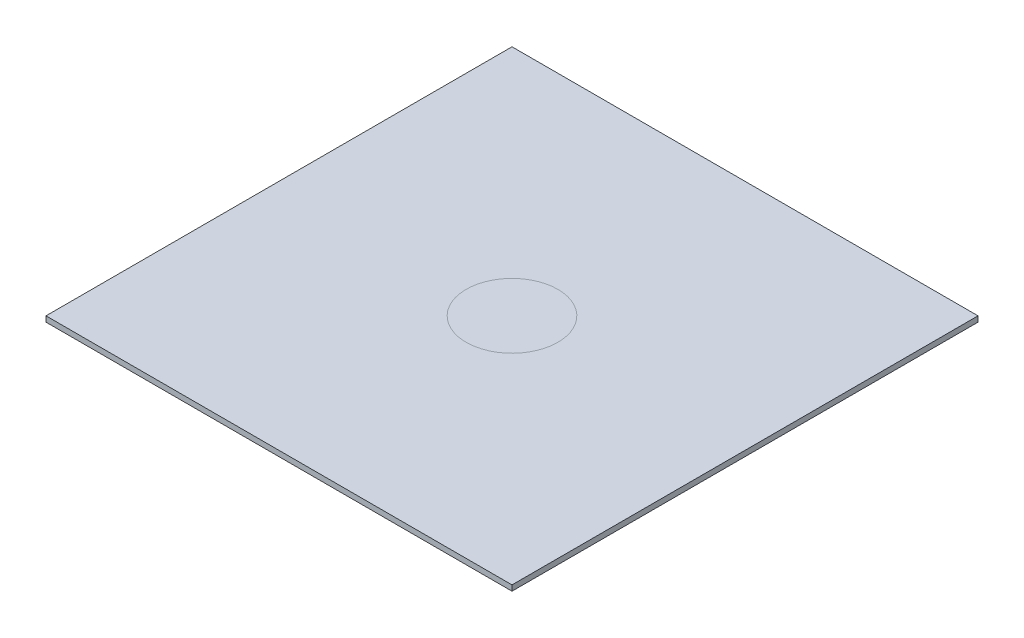
ISO-10303-21;
HEADER;
FILE_DESCRIPTION(('STEP AP214'),'2;1');
FILE_NAME('part.step','',(''),(''),'','','');
FILE_SCHEMA(('AUTOMOTIVE_DESIGN { 1 0 10303 214 1 1 1 1 }'));
ENDSEC;
DATA;
#1=APPLICATION_CONTEXT('core data for automotive mechanical design processes');
#2=APPLICATION_PROTOCOL_DEFINITION('international standard','automotive_design',2000,#1);
#3=PRODUCT_CONTEXT('',#1,'mechanical');
#4=PRODUCT('Part','Part','',(#3));
#5=PRODUCT_RELATED_PRODUCT_CATEGORY('part','',(#4));
#6=PRODUCT_DEFINITION_FORMATION('','',#4);
#7=PRODUCT_DEFINITION_CONTEXT('part definition',#1,'design');
#8=PRODUCT_DEFINITION('design','',#6,#7);
#9=PRODUCT_DEFINITION_SHAPE('','',#8);
#10=(LENGTH_UNIT() NAMED_UNIT(*) SI_UNIT(.MILLI.,.METRE.));
#11=(NAMED_UNIT(*) PLANE_ANGLE_UNIT() SI_UNIT($,.RADIAN.));
#12=(NAMED_UNIT(*) SI_UNIT($,.STERADIAN.) SOLID_ANGLE_UNIT());
#13=UNCERTAINTY_MEASURE_WITH_UNIT(LENGTH_MEASURE(1.E-05),#10,'distance_accuracy_value','');
#14=(GEOMETRIC_REPRESENTATION_CONTEXT(3) GLOBAL_UNCERTAINTY_ASSIGNED_CONTEXT((#13)) GLOBAL_UNIT_ASSIGNED_CONTEXT((#10,
#11,#12)) REPRESENTATION_CONTEXT('',''));
#15=CARTESIAN_POINT('',(0.,0.,0.));
#16=DIRECTION('',(0.,0.,1.));
#17=DIRECTION('',(1.,0.,0.));
#18=AXIS2_PLACEMENT_3D('',#15,#16,#17);
#19=CARTESIAN_POINT('',(0.,1.5,0.));
#20=DIRECTION('',(0.,-1.,0.));
#21=DIRECTION('',(0.,0.,-1.));
#22=AXIS2_PLACEMENT_3D('',#19,#20,#21);
#23=PLANE('',#22);
#24=DIRECTION('',(0.,0.,-1.));
#25=VECTOR('',#24,1.);
#26=CARTESIAN_POINT('',(127.,1.5,127.));
#27=LINE('',#26,#25);
#28=CARTESIAN_POINT('',(127.,1.5,127.));
#29=VERTEX_POINT('',#28);
#30=CARTESIAN_POINT('',(127.,1.5,-127.));
#31=VERTEX_POINT('',#30);
#32=EDGE_CURVE('E101',#29,#31,#27,.T.);
#33=ORIENTED_EDGE('',*,*,#32,.T.);
#34=DIRECTION('',(-1.,0.,0.));
#35=VECTOR('',#34,1.);
#36=CARTESIAN_POINT('',(-127.,1.5,-127.));
#37=LINE('',#36,#35);
#38=CARTESIAN_POINT('',(-127.,1.5,-127.));
#39=VERTEX_POINT('',#38);
#40=EDGE_CURVE('E90',#31,#39,#37,.T.);
#41=ORIENTED_EDGE('',*,*,#40,.T.);
#42=DIRECTION('',(0.,0.,1.));
#43=VECTOR('',#42,1.);
#44=CARTESIAN_POINT('',(-127.,1.5,127.));
#45=LINE('',#44,#43);
#46=CARTESIAN_POINT('',(-127.,1.5,127.));
#47=VERTEX_POINT('',#46);
#48=EDGE_CURVE('E100',#39,#47,#45,.T.);
#49=ORIENTED_EDGE('',*,*,#48,.T.);
#50=DIRECTION('',(1.,0.,0.));
#51=VECTOR('',#50,1.);
#52=CARTESIAN_POINT('',(-127.,1.5,127.));
#53=LINE('',#52,#51);
#54=EDGE_CURVE('E106',#47,#29,#53,.T.);
#55=ORIENTED_EDGE('',*,*,#54,.T.);
#56=EDGE_LOOP('',(#33,#41,#49,#55));
#57=FACE_BOUND('',#56,.T.);
#58=CARTESIAN_POINT('',(0.,1.5,0.));
#59=DIRECTION('',(0.,-1.,0.));
#60=DIRECTION('',(0.,0.,-1.));
#61=AXIS2_PLACEMENT_3D('',#58,#59,#60);
#62=CIRCLE('',#61,25.);
#63=CARTESIAN_POINT('',(0.,1.5,-25.));
#64=VERTEX_POINT('',#63);
#65=EDGE_CURVE('E11',#64,#64,#62,.F.);
#66=ORIENTED_EDGE('',*,*,#65,.F.);
#67=EDGE_LOOP('',(#66));
#68=FACE_BOUND('',#67,.T.);
#69=ADVANCED_FACE('F39',(#57,#68),#23,.F.);
#70=CARTESIAN_POINT('',(0.,-1.5,0.));
#71=DIRECTION('',(0.,-1.,0.));
#72=DIRECTION('',(0.,0.,-1.));
#73=AXIS2_PLACEMENT_3D('',#70,#71,#72);
#74=PLANE('',#73);
#75=DIRECTION('',(0.,0.,-1.));
#76=VECTOR('',#75,1.);
#77=CARTESIAN_POINT('',(127.,-1.5,127.));
#78=LINE('',#77,#76);
#79=CARTESIAN_POINT('',(127.,-1.5,127.));
#80=VERTEX_POINT('',#79);
#81=CARTESIAN_POINT('',(127.,-1.5,-127.));
#82=VERTEX_POINT('',#81);
#83=EDGE_CURVE('E113',#80,#82,#78,.T.);
#84=ORIENTED_EDGE('',*,*,#83,.F.);
#85=DIRECTION('',(1.,0.,0.));
#86=VECTOR('',#85,1.);
#87=CARTESIAN_POINT('',(-127.,-1.5,127.));
#88=LINE('',#87,#86);
#89=CARTESIAN_POINT('',(-127.,-1.5,127.));
#90=VERTEX_POINT('',#89);
#91=EDGE_CURVE('E110',#90,#80,#88,.T.);
#92=ORIENTED_EDGE('',*,*,#91,.F.);
#93=DIRECTION('',(0.,0.,1.));
#94=VECTOR('',#93,1.);
#95=CARTESIAN_POINT('',(-127.,-1.5,127.));
#96=LINE('',#95,#94);
#97=CARTESIAN_POINT('',(-127.,-1.5,-127.));
#98=VERTEX_POINT('',#97);
#99=EDGE_CURVE('E207',#98,#90,#96,.T.);
#100=ORIENTED_EDGE('',*,*,#99,.F.);
#101=DIRECTION('',(-1.,0.,0.));
#102=VECTOR('',#101,1.);
#103=CARTESIAN_POINT('',(-127.,-1.5,-127.));
#104=LINE('',#103,#102);
#105=EDGE_CURVE('E210',#82,#98,#104,.T.);
#106=ORIENTED_EDGE('',*,*,#105,.F.);
#107=EDGE_LOOP('',(#84,#92,#100,#106));
#108=FACE_BOUND('',#107,.T.);
#109=DIRECTION('',(1.,0.,0.));
#110=VECTOR('',#109,1.);
#111=CARTESIAN_POINT('',(0.,-1.5,107.));
#112=LINE('',#111,#110);
#113=CARTESIAN_POINT('',(-107.,-1.5,107.));
#114=VERTEX_POINT('',#113);
#115=CARTESIAN_POINT('',(107.,-1.5,107.));
#116=VERTEX_POINT('',#115);
#117=EDGE_CURVE('E58',#114,#116,#112,.T.);
#118=ORIENTED_EDGE('',*,*,#117,.T.);
#119=DIRECTION('',(0.,0.,-1.));
#120=VECTOR('',#119,1.);
#121=CARTESIAN_POINT('',(107.,-1.5,0.));
#122=LINE('',#121,#120);
#123=CARTESIAN_POINT('',(107.,-1.5,-107.));
#124=VERTEX_POINT('',#123);
#125=EDGE_CURVE('E48',#116,#124,#122,.T.);
#126=ORIENTED_EDGE('',*,*,#125,.T.);
#127=DIRECTION('',(-1.,0.,0.));
#128=VECTOR('',#127,1.);
#129=CARTESIAN_POINT('',(0.,-1.5,-107.));
#130=LINE('',#129,#128);
#131=CARTESIAN_POINT('',(-107.,-1.5,-107.));
#132=VERTEX_POINT('',#131);
#133=EDGE_CURVE('E114',#124,#132,#130,.T.);
#134=ORIENTED_EDGE('',*,*,#133,.T.);
#135=DIRECTION('',(0.,0.,1.));
#136=VECTOR('',#135,1.);
#137=CARTESIAN_POINT('',(-107.,-1.5,0.));
#138=LINE('',#137,#136);
#139=EDGE_CURVE('E118',#132,#114,#138,.T.);
#140=ORIENTED_EDGE('',*,*,#139,.T.);
#141=EDGE_LOOP('',(#118,#126,#134,#140));
#142=FACE_BOUND('',#141,.T.);
#143=ADVANCED_FACE('F131',(#108,#142),#74,.T.);
#144=CARTESIAN_POINT('',(127.,1.5,127.));
#145=DIRECTION('',(-1.,0.,0.));
#146=DIRECTION('',(0.,0.,1.));
#147=AXIS2_PLACEMENT_3D('',#144,#145,#146);
#148=PLANE('',#147);
#149=ORIENTED_EDGE('',*,*,#83,.T.);
#150=DIRECTION('',(0.,-1.,0.));
#151=VECTOR('',#150,1.);
#152=CARTESIAN_POINT('',(127.,1.5,-127.));
#153=LINE('',#152,#151);
#154=EDGE_CURVE('E94',#31,#82,#153,.T.);
#155=ORIENTED_EDGE('',*,*,#154,.F.);
#156=ORIENTED_EDGE('',*,*,#32,.F.);
#157=DIRECTION('',(0.,-1.,0.));
#158=VECTOR('',#157,1.);
#159=CARTESIAN_POINT('',(127.,1.5,127.));
#160=LINE('',#159,#158);
#161=EDGE_CURVE('E212',#29,#80,#160,.T.);
#162=ORIENTED_EDGE('',*,*,#161,.T.);
#163=EDGE_LOOP('',(#149,#155,#156,#162));
#164=FACE_BOUND('',#163,.T.);
#165=ADVANCED_FACE('F41',(#164),#148,.F.);
#166=CARTESIAN_POINT('',(-127.,1.5,-127.));
#167=DIRECTION('',(0.,0.,1.));
#168=DIRECTION('',(1.,0.,0.));
#169=AXIS2_PLACEMENT_3D('',#166,#167,#168);
#170=PLANE('',#169);
#171=ORIENTED_EDGE('',*,*,#105,.T.);
#172=DIRECTION('',(0.,-1.,0.));
#173=VECTOR('',#172,1.);
#174=CARTESIAN_POINT('',(-127.,1.5,-127.));
#175=LINE('',#174,#173);
#176=EDGE_CURVE('E97',#39,#98,#175,.T.);
#177=ORIENTED_EDGE('',*,*,#176,.F.);
#178=ORIENTED_EDGE('',*,*,#40,.F.);
#179=ORIENTED_EDGE('',*,*,#154,.T.);
#180=EDGE_LOOP('',(#171,#177,#178,#179));
#181=FACE_BOUND('',#180,.T.);
#182=ADVANCED_FACE('F92',(#181),#170,.F.);
#183=CARTESIAN_POINT('',(-127.,1.5,127.));
#184=DIRECTION('',(1.,0.,0.));
#185=DIRECTION('',(0.,0.,-1.));
#186=AXIS2_PLACEMENT_3D('',#183,#184,#185);
#187=PLANE('',#186);
#188=ORIENTED_EDGE('',*,*,#99,.T.);
#189=DIRECTION('',(0.,-1.,0.));
#190=VECTOR('',#189,1.);
#191=CARTESIAN_POINT('',(-127.,1.5,127.));
#192=LINE('',#191,#190);
#193=EDGE_CURVE('E120',#47,#90,#192,.T.);
#194=ORIENTED_EDGE('',*,*,#193,.F.);
#195=ORIENTED_EDGE('',*,*,#48,.F.);
#196=ORIENTED_EDGE('',*,*,#176,.T.);
#197=EDGE_LOOP('',(#188,#194,#195,#196));
#198=FACE_BOUND('',#197,.T.);
#199=ADVANCED_FACE('F167',(#198),#187,.F.);
#200=CARTESIAN_POINT('',(-127.,1.5,127.));
#201=DIRECTION('',(0.,0.,-1.));
#202=DIRECTION('',(-1.,0.,0.));
#203=AXIS2_PLACEMENT_3D('',#200,#201,#202);
#204=PLANE('',#203);
#205=ORIENTED_EDGE('',*,*,#91,.T.);
#206=ORIENTED_EDGE('',*,*,#161,.F.);
#207=ORIENTED_EDGE('',*,*,#54,.F.);
#208=ORIENTED_EDGE('',*,*,#193,.T.);
#209=EDGE_LOOP('',(#205,#206,#207,#208));
#210=FACE_BOUND('',#209,.T.);
#211=ADVANCED_FACE('F141',(#210),#204,.F.);
#212=ORIENTED_EDGE('',*,*,#65,.T.);
#213=EDGE_LOOP('',(#212));
#214=FACE_BOUND('',#213,.T.);
#215=ADVANCED_FACE('F134',(#214),#23,.F.);
#216=ORIENTED_EDGE('',*,*,#125,.F.);
#217=ORIENTED_EDGE('',*,*,#117,.F.);
#218=ORIENTED_EDGE('',*,*,#139,.F.);
#219=ORIENTED_EDGE('',*,*,#133,.F.);
#220=EDGE_LOOP('',(#216,#217,#218,#219));
#221=FACE_BOUND('',#220,.T.);
#222=ADVANCED_FACE('F132',(#221),#74,.T.);
#223=CLOSED_SHELL('',(#69,#143,#165,#182,#199,#211,#215,#222));
#224=MANIFOLD_SOLID_BREP('B2',#223);
#225=ADVANCED_BREP_SHAPE_REPRESENTATION('',(#18,#224),#14);
#226=SHAPE_DEFINITION_REPRESENTATION(#9,#225);
ENDSEC;
END-ISO-10303-21;
